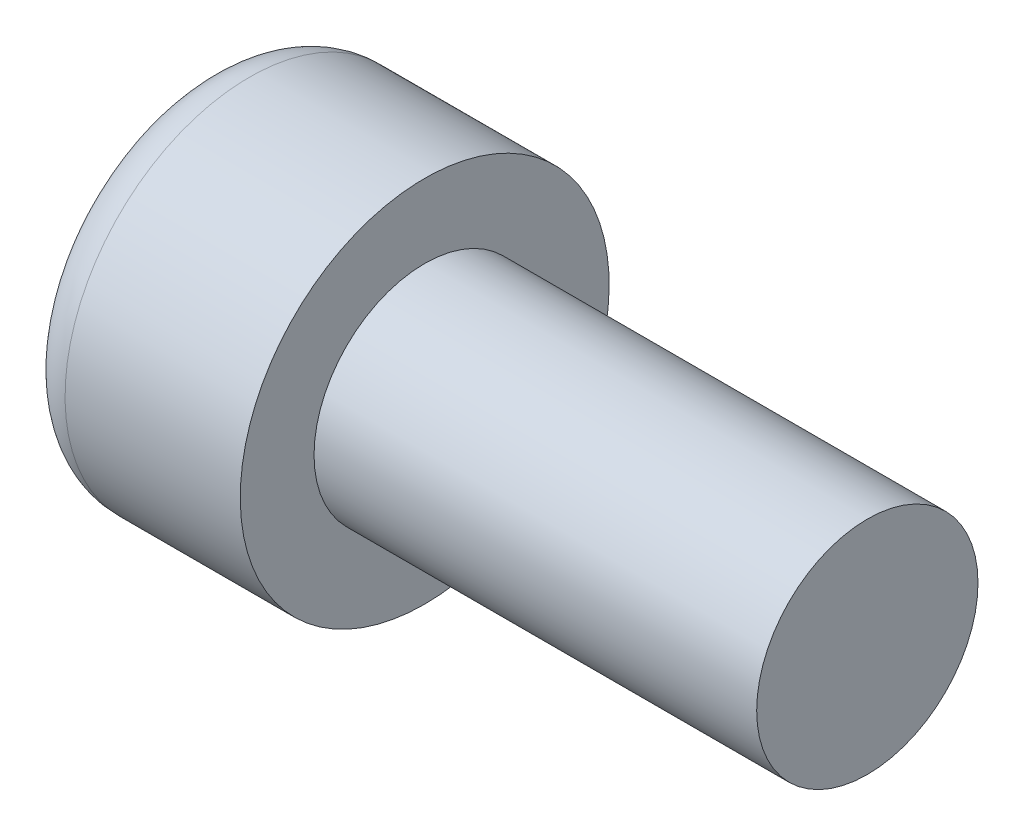
ISO-10303-21;
HEADER;
FILE_DESCRIPTION(('STEP AP214'),'2;1');
FILE_NAME('part.step','',(''),(''),'','','');
FILE_SCHEMA(('AUTOMOTIVE_DESIGN { 1 0 10303 214 1 1 1 1 }'));
ENDSEC;
DATA;
#1=APPLICATION_CONTEXT('core data for automotive mechanical design processes');
#2=APPLICATION_PROTOCOL_DEFINITION('international standard','automotive_design',2000,#1);
#3=PRODUCT_CONTEXT('',#1,'mechanical');
#4=PRODUCT('Part','Part','',(#3));
#5=PRODUCT_RELATED_PRODUCT_CATEGORY('part','',(#4));
#6=PRODUCT_DEFINITION_FORMATION('','',#4);
#7=PRODUCT_DEFINITION_CONTEXT('part definition',#1,'design');
#8=PRODUCT_DEFINITION('design','',#6,#7);
#9=PRODUCT_DEFINITION_SHAPE('','',#8);
#10=(LENGTH_UNIT() NAMED_UNIT(*) SI_UNIT(.MILLI.,.METRE.));
#11=(NAMED_UNIT(*) PLANE_ANGLE_UNIT() SI_UNIT($,.RADIAN.));
#12=(NAMED_UNIT(*) SI_UNIT($,.STERADIAN.) SOLID_ANGLE_UNIT());
#13=UNCERTAINTY_MEASURE_WITH_UNIT(LENGTH_MEASURE(1.E-05),#10,'distance_accuracy_value','');
#14=(GEOMETRIC_REPRESENTATION_CONTEXT(3) GLOBAL_UNCERTAINTY_ASSIGNED_CONTEXT((#13)) GLOBAL_UNIT_ASSIGNED_CONTEXT((#10,
#11,#12)) REPRESENTATION_CONTEXT('',''));
#15=CARTESIAN_POINT('',(0.,0.,0.));
#16=DIRECTION('',(0.,0.,1.));
#17=DIRECTION('',(1.,0.,0.));
#18=AXIS2_PLACEMENT_3D('',#15,#16,#17);
#19=CARTESIAN_POINT('',(0.,0.,0.));
#20=DIRECTION('',(1.,0.,0.));
#21=DIRECTION('',(0.,1.,0.));
#22=AXIS2_PLACEMENT_3D('',#19,#20,#21);
#23=PLANE('',#22);
#24=DIRECTION('',(0.,-0.5,-0.866025403784439));
#25=VECTOR('',#24,1.);
#26=CARTESIAN_POINT('',(0.,2.88675134594813,0.));
#27=LINE('',#26,#25);
#28=CARTESIAN_POINT('',(0.,2.88675134594813,0.));
#29=VERTEX_POINT('',#28);
#30=CARTESIAN_POINT('',(0.,1.44337567297407,-2.5));
#31=VERTEX_POINT('',#30);
#32=EDGE_CURVE('E123',#29,#31,#27,.T.);
#33=ORIENTED_EDGE('',*,*,#32,.F.);
#34=DIRECTION('',(0.,0.5,-0.866025403784439));
#35=VECTOR('',#34,1.);
#36=CARTESIAN_POINT('',(0.,1.44337567297407,2.5));
#37=LINE('',#36,#35);
#38=CARTESIAN_POINT('',(0.,1.44337567297407,2.5));
#39=VERTEX_POINT('',#38);
#40=EDGE_CURVE('E49',#39,#29,#37,.T.);
#41=ORIENTED_EDGE('',*,*,#40,.F.);
#42=DIRECTION('',(0.,1.,0.));
#43=VECTOR('',#42,1.);
#44=CARTESIAN_POINT('',(0.,-1.44337567297407,2.5));
#45=LINE('',#44,#43);
#46=CARTESIAN_POINT('',(0.,-1.44337567297407,2.5));
#47=VERTEX_POINT('',#46);
#48=EDGE_CURVE('E132',#47,#39,#45,.T.);
#49=ORIENTED_EDGE('',*,*,#48,.F.);
#50=DIRECTION('',(0.,0.5,0.866025403784439));
#51=VECTOR('',#50,1.);
#52=CARTESIAN_POINT('',(0.,-2.88675134594813,0.));
#53=LINE('',#52,#51);
#54=CARTESIAN_POINT('',(0.,-2.88675134594813,0.));
#55=VERTEX_POINT('',#54);
#56=EDGE_CURVE('E130',#55,#47,#53,.T.);
#57=ORIENTED_EDGE('',*,*,#56,.F.);
#58=DIRECTION('',(0.,-0.5,0.866025403784439));
#59=VECTOR('',#58,1.);
#60=CARTESIAN_POINT('',(0.,-1.44337567297406,-2.5));
#61=LINE('',#60,#59);
#62=CARTESIAN_POINT('',(0.,-1.44337567297406,-2.5));
#63=VERTEX_POINT('',#62);
#64=EDGE_CURVE('E97',#63,#55,#61,.T.);
#65=ORIENTED_EDGE('',*,*,#64,.F.);
#66=DIRECTION('',(0.,-1.,0.));
#67=VECTOR('',#66,1.);
#68=CARTESIAN_POINT('',(0.,1.44337567297407,-2.5));
#69=LINE('',#68,#67);
#70=EDGE_CURVE('E126',#31,#63,#69,.T.);
#71=ORIENTED_EDGE('',*,*,#70,.F.);
#72=EDGE_LOOP('',(#33,#41,#49,#57,#65,#71));
#73=FACE_BOUND('',#72,.T.);
#74=CARTESIAN_POINT('',(0.,0.,0.));
#75=DIRECTION('',(-1.,0.,0.));
#76=DIRECTION('',(0.,-1.,0.));
#77=AXIS2_PLACEMENT_3D('',#74,#75,#76);
#78=CIRCLE('',#77,3.75);
#79=CARTESIAN_POINT('',(0.,-3.75,0.));
#80=VERTEX_POINT('',#79);
#81=EDGE_CURVE('E11',#80,#80,#78,.T.);
#82=ORIENTED_EDGE('',*,*,#81,.T.);
#83=EDGE_LOOP('',(#82));
#84=FACE_BOUND('',#83,.T.);
#85=ADVANCED_FACE('F35',(#73,#84),#23,.F.);
#86=CARTESIAN_POINT('',(1.25,0.,0.));
#87=DIRECTION('',(-1.,0.,0.));
#88=DIRECTION('',(0.,-1.,0.));
#89=AXIS2_PLACEMENT_3D('',#86,#87,#88);
#90=TOROIDAL_SURFACE('',#89,3.75,1.25);
#91=ORIENTED_EDGE('',*,*,#81,.F.);
#92=EDGE_LOOP('',(#91));
#93=FACE_BOUND('',#92,.T.);
#94=CARTESIAN_POINT('',(1.25,0.,0.));
#95=DIRECTION('',(-1.,0.,0.));
#96=DIRECTION('',(0.,-1.,0.));
#97=AXIS2_PLACEMENT_3D('',#94,#95,#96);
#98=CIRCLE('',#97,5.);
#99=CARTESIAN_POINT('',(1.25,-5.,0.));
#100=VERTEX_POINT('',#99);
#101=EDGE_CURVE('E42',#100,#100,#98,.T.);
#102=ORIENTED_EDGE('',*,*,#101,.T.);
#103=EDGE_LOOP('',(#102));
#104=FACE_BOUND('',#103,.T.);
#105=ADVANCED_FACE('F152',(#93,#104),#90,.T.);
#106=CARTESIAN_POINT('',(0.,0.,0.));
#107=DIRECTION('',(-1.,0.,0.));
#108=DIRECTION('',(0.,-1.,0.));
#109=AXIS2_PLACEMENT_3D('',#106,#107,#108);
#110=CYLINDRICAL_SURFACE('',#109,5.);
#111=ORIENTED_EDGE('',*,*,#101,.F.);
#112=EDGE_LOOP('',(#111));
#113=FACE_BOUND('',#112,.T.);
#114=CARTESIAN_POINT('',(6.,0.,0.));
#115=DIRECTION('',(-1.,0.,0.));
#116=DIRECTION('',(0.,-1.,0.));
#117=AXIS2_PLACEMENT_3D('',#114,#115,#116);
#118=CIRCLE('',#117,5.);
#119=CARTESIAN_POINT('',(6.,-5.,0.));
#120=VERTEX_POINT('',#119);
#121=EDGE_CURVE('E147',#120,#120,#118,.T.);
#122=ORIENTED_EDGE('',*,*,#121,.T.);
#123=EDGE_LOOP('',(#122));
#124=FACE_BOUND('',#123,.T.);
#125=ADVANCED_FACE('F154',(#113,#124),#110,.T.);
#126=CARTESIAN_POINT('',(6.,5.,0.));
#127=DIRECTION('',(-1.,0.,0.));
#128=DIRECTION('',(0.,-1.,0.));
#129=AXIS2_PLACEMENT_3D('',#126,#127,#128);
#130=PLANE('',#129);
#131=ORIENTED_EDGE('',*,*,#121,.F.);
#132=EDGE_LOOP('',(#131));
#133=FACE_BOUND('',#132,.T.);
#134=CARTESIAN_POINT('',(6.,0.,0.));
#135=DIRECTION('',(-1.,0.,0.));
#136=DIRECTION('',(0.,-1.,0.));
#137=AXIS2_PLACEMENT_3D('',#134,#135,#136);
#138=CIRCLE('',#137,2.99999999999999);
#139=CARTESIAN_POINT('',(6.,-2.99999999999999,0.));
#140=VERTEX_POINT('',#139);
#141=EDGE_CURVE('E144',#140,#140,#138,.T.);
#142=ORIENTED_EDGE('',*,*,#141,.T.);
#143=EDGE_LOOP('',(#142));
#144=FACE_BOUND('',#143,.T.);
#145=ADVANCED_FACE('F157',(#133,#144),#130,.F.);
#146=CARTESIAN_POINT('',(0.,0.,0.));
#147=DIRECTION('',(-1.,0.,0.));
#148=DIRECTION('',(0.,-1.,0.));
#149=AXIS2_PLACEMENT_3D('',#146,#147,#148);
#150=CYLINDRICAL_SURFACE('',#149,2.99999999999999);
#151=ORIENTED_EDGE('',*,*,#141,.F.);
#152=EDGE_LOOP('',(#151));
#153=FACE_BOUND('',#152,.T.);
#154=CARTESIAN_POINT('',(18.,0.,0.));
#155=DIRECTION('',(-1.,0.,0.));
#156=DIRECTION('',(0.,-1.,0.));
#157=AXIS2_PLACEMENT_3D('',#154,#155,#156);
#158=CIRCLE('',#157,3.);
#159=CARTESIAN_POINT('',(18.,-2.99999999999999,0.));
#160=VERTEX_POINT('',#159);
#161=EDGE_CURVE('E136',#160,#160,#158,.T.);
#162=ORIENTED_EDGE('',*,*,#161,.T.);
#163=EDGE_LOOP('',(#162));
#164=FACE_BOUND('',#163,.T.);
#165=ADVANCED_FACE('F163',(#153,#164),#150,.T.);
#166=CARTESIAN_POINT('',(18.,3.,0.));
#167=DIRECTION('',(-1.,0.,0.));
#168=DIRECTION('',(0.,-1.,0.));
#169=AXIS2_PLACEMENT_3D('',#166,#167,#168);
#170=PLANE('',#169);
#171=ORIENTED_EDGE('',*,*,#161,.F.);
#172=EDGE_LOOP('',(#171));
#173=FACE_BOUND('',#172,.T.);
#174=ADVANCED_FACE('F169',(#173),#170,.F.);
#175=CARTESIAN_POINT('',(3.5,1.44337567297406,2.5));
#176=DIRECTION('',(0.,0.866025403784439,0.5));
#177=DIRECTION('',(0.,-0.5,0.866025403784439));
#178=AXIS2_PLACEMENT_3D('',#175,#176,#177);
#179=PLANE('',#178);
#180=ORIENTED_EDGE('',*,*,#40,.T.);
#181=DIRECTION('',(-1.,0.,0.));
#182=VECTOR('',#181,1.);
#183=CARTESIAN_POINT('',(3.5,2.88675134594813,0.));
#184=LINE('',#183,#182);
#185=CARTESIAN_POINT('',(3.5,2.88675134594813,0.));
#186=VERTEX_POINT('',#185);
#187=EDGE_CURVE('E79',#186,#29,#184,.T.);
#188=ORIENTED_EDGE('',*,*,#187,.F.);
#189=DIRECTION('',(0.,0.5,-0.866025403784439));
#190=VECTOR('',#189,1.);
#191=CARTESIAN_POINT('',(3.5,1.44337567297406,2.5));
#192=LINE('',#191,#190);
#193=CARTESIAN_POINT('',(3.5,1.44337567297406,2.5));
#194=VERTEX_POINT('',#193);
#195=EDGE_CURVE('E134',#194,#186,#192,.T.);
#196=ORIENTED_EDGE('',*,*,#195,.F.);
#197=DIRECTION('',(-1.,0.,0.));
#198=VECTOR('',#197,1.);
#199=CARTESIAN_POINT('',(3.5,1.44337567297406,2.5));
#200=LINE('',#199,#198);
#201=EDGE_CURVE('E57',#194,#39,#200,.T.);
#202=ORIENTED_EDGE('',*,*,#201,.T.);
#203=EDGE_LOOP('',(#180,#188,#196,#202));
#204=FACE_BOUND('',#203,.T.);
#205=ADVANCED_FACE('F174',(#204),#179,.F.);
#206=CARTESIAN_POINT('',(3.5,-1.44337567297407,2.5));
#207=DIRECTION('',(0.,0.,1.));
#208=DIRECTION('',(1.,0.,0.));
#209=AXIS2_PLACEMENT_3D('',#206,#207,#208);
#210=PLANE('',#209);
#211=ORIENTED_EDGE('',*,*,#48,.T.);
#212=ORIENTED_EDGE('',*,*,#201,.F.);
#213=DIRECTION('',(0.,1.,0.));
#214=VECTOR('',#213,1.);
#215=CARTESIAN_POINT('',(3.5,-1.44337567297407,2.5));
#216=LINE('',#215,#214);
#217=CARTESIAN_POINT('',(3.5,-1.44337567297407,2.5));
#218=VERTEX_POINT('',#217);
#219=EDGE_CURVE('E109',#218,#194,#216,.T.);
#220=ORIENTED_EDGE('',*,*,#219,.F.);
#221=DIRECTION('',(-1.,0.,0.));
#222=VECTOR('',#221,1.);
#223=CARTESIAN_POINT('',(3.5,-1.44337567297407,2.5));
#224=LINE('',#223,#222);
#225=EDGE_CURVE('E101',#218,#47,#224,.T.);
#226=ORIENTED_EDGE('',*,*,#225,.T.);
#227=EDGE_LOOP('',(#211,#212,#220,#226));
#228=FACE_BOUND('',#227,.T.);
#229=ADVANCED_FACE('F179',(#228),#210,.F.);
#230=CARTESIAN_POINT('',(3.5,-2.88675134594813,0.));
#231=DIRECTION('',(0.,-0.866025403784439,0.5));
#232=DIRECTION('',(0.,-0.5,-0.866025403784439));
#233=AXIS2_PLACEMENT_3D('',#230,#231,#232);
#234=PLANE('',#233);
#235=ORIENTED_EDGE('',*,*,#56,.T.);
#236=ORIENTED_EDGE('',*,*,#225,.F.);
#237=DIRECTION('',(0.,0.5,0.866025403784439));
#238=VECTOR('',#237,1.);
#239=CARTESIAN_POINT('',(3.5,-2.88675134594813,0.));
#240=LINE('',#239,#238);
#241=CARTESIAN_POINT('',(3.5,-2.88675134594813,0.));
#242=VERTEX_POINT('',#241);
#243=EDGE_CURVE('E105',#242,#218,#240,.T.);
#244=ORIENTED_EDGE('',*,*,#243,.F.);
#245=DIRECTION('',(-1.,0.,0.));
#246=VECTOR('',#245,1.);
#247=CARTESIAN_POINT('',(3.5,-2.88675134594813,0.));
#248=LINE('',#247,#246);
#249=EDGE_CURVE('E90',#242,#55,#248,.T.);
#250=ORIENTED_EDGE('',*,*,#249,.T.);
#251=EDGE_LOOP('',(#235,#236,#244,#250));
#252=FACE_BOUND('',#251,.T.);
#253=ADVANCED_FACE('F106',(#252),#234,.F.);
#254=CARTESIAN_POINT('',(3.5,-1.44337567297406,-2.5));
#255=DIRECTION('',(0.,-0.866025403784439,-0.5));
#256=DIRECTION('',(0.,0.5,-0.866025403784439));
#257=AXIS2_PLACEMENT_3D('',#254,#255,#256);
#258=PLANE('',#257);
#259=ORIENTED_EDGE('',*,*,#64,.T.);
#260=ORIENTED_EDGE('',*,*,#249,.F.);
#261=DIRECTION('',(0.,-0.5,0.866025403784439));
#262=VECTOR('',#261,1.);
#263=CARTESIAN_POINT('',(3.5,-1.44337567297406,-2.5));
#264=LINE('',#263,#262);
#265=CARTESIAN_POINT('',(3.5,-1.44337567297406,-2.5));
#266=VERTEX_POINT('',#265);
#267=EDGE_CURVE('E94',#266,#242,#264,.T.);
#268=ORIENTED_EDGE('',*,*,#267,.F.);
#269=DIRECTION('',(-1.,0.,0.));
#270=VECTOR('',#269,1.);
#271=CARTESIAN_POINT('',(3.5,-1.44337567297406,-2.5));
#272=LINE('',#271,#270);
#273=EDGE_CURVE('E102',#266,#63,#272,.T.);
#274=ORIENTED_EDGE('',*,*,#273,.T.);
#275=EDGE_LOOP('',(#259,#260,#268,#274));
#276=FACE_BOUND('',#275,.T.);
#277=ADVANCED_FACE('F92',(#276),#258,.F.);
#278=CARTESIAN_POINT('',(3.5,1.44337567297406,-2.5));
#279=DIRECTION('',(0.,0.,-1.));
#280=DIRECTION('',(-1.,0.,0.));
#281=AXIS2_PLACEMENT_3D('',#278,#279,#280);
#282=PLANE('',#281);
#283=ORIENTED_EDGE('',*,*,#70,.T.);
#284=ORIENTED_EDGE('',*,*,#273,.F.);
#285=DIRECTION('',(0.,-1.,0.));
#286=VECTOR('',#285,1.);
#287=CARTESIAN_POINT('',(3.5,1.44337567297406,-2.5));
#288=LINE('',#287,#286);
#289=CARTESIAN_POINT('',(3.5,1.44337567297406,-2.5));
#290=VERTEX_POINT('',#289);
#291=EDGE_CURVE('E115',#290,#266,#288,.T.);
#292=ORIENTED_EDGE('',*,*,#291,.F.);
#293=DIRECTION('',(-1.,0.,0.));
#294=VECTOR('',#293,1.);
#295=CARTESIAN_POINT('',(3.5,1.44337567297406,-2.5));
#296=LINE('',#295,#294);
#297=EDGE_CURVE('E139',#290,#31,#296,.T.);
#298=ORIENTED_EDGE('',*,*,#297,.T.);
#299=EDGE_LOOP('',(#283,#284,#292,#298));
#300=FACE_BOUND('',#299,.T.);
#301=ADVANCED_FACE('F205',(#300),#282,.F.);
#302=CARTESIAN_POINT('',(3.5,2.88675134594813,0.));
#303=DIRECTION('',(0.,0.866025403784439,-0.5));
#304=DIRECTION('',(0.,0.5,0.866025403784439));
#305=AXIS2_PLACEMENT_3D('',#302,#303,#304);
#306=PLANE('',#305);
#307=ORIENTED_EDGE('',*,*,#32,.T.);
#308=ORIENTED_EDGE('',*,*,#297,.F.);
#309=DIRECTION('',(0.,-0.5,-0.866025403784439));
#310=VECTOR('',#309,1.);
#311=CARTESIAN_POINT('',(3.5,2.88675134594813,0.));
#312=LINE('',#311,#310);
#313=EDGE_CURVE('E117',#186,#290,#312,.T.);
#314=ORIENTED_EDGE('',*,*,#313,.F.);
#315=ORIENTED_EDGE('',*,*,#187,.T.);
#316=EDGE_LOOP('',(#307,#308,#314,#315));
#317=FACE_BOUND('',#316,.T.);
#318=ADVANCED_FACE('F193',(#317),#306,.F.);
#319=CARTESIAN_POINT('',(3.5,0.,0.));
#320=DIRECTION('',(-1.,0.,0.));
#321=DIRECTION('',(0.,-1.,0.));
#322=AXIS2_PLACEMENT_3D('',#319,#320,#321);
#323=PLANE('',#322);
#324=ORIENTED_EDGE('',*,*,#195,.T.);
#325=ORIENTED_EDGE('',*,*,#313,.T.);
#326=ORIENTED_EDGE('',*,*,#291,.T.);
#327=ORIENTED_EDGE('',*,*,#267,.T.);
#328=ORIENTED_EDGE('',*,*,#243,.T.);
#329=ORIENTED_EDGE('',*,*,#219,.T.);
#330=EDGE_LOOP('',(#324,#325,#326,#327,#328,#329));
#331=FACE_BOUND('',#330,.T.);
#332=ADVANCED_FACE('F112',(#331),#323,.T.);
#333=CLOSED_SHELL('',(#85,#105,#125,#145,#165,#174,#205,#229,#253,#277,#301,#318,#332));
#334=MANIFOLD_SOLID_BREP('B2',#333);
#335=ADVANCED_BREP_SHAPE_REPRESENTATION('',(#18,#334),#14);
#336=SHAPE_DEFINITION_REPRESENTATION(#9,#335);
ENDSEC;
END-ISO-10303-21;
